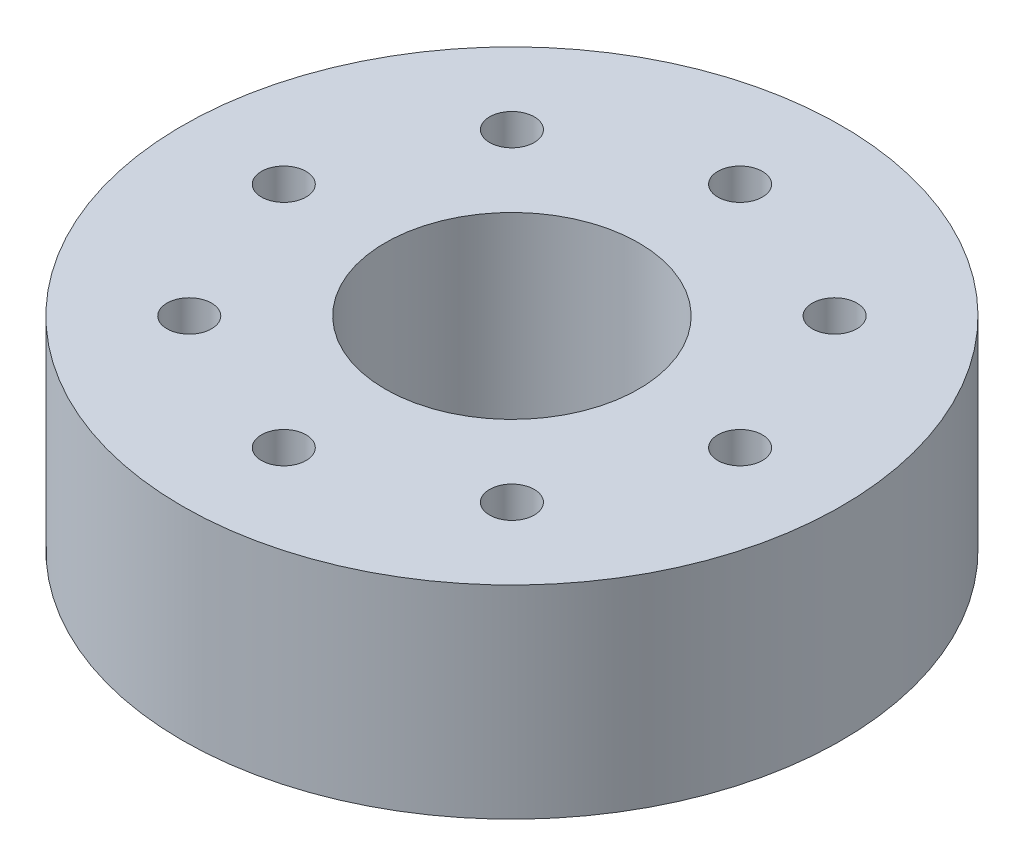
ISO-10303-21;
HEADER;
FILE_DESCRIPTION(('STEP AP214'),'2;1');
FILE_NAME('part.step','',(''),(''),'','','');
FILE_SCHEMA(('AUTOMOTIVE_DESIGN { 1 0 10303 214 1 1 1 1 }'));
ENDSEC;
DATA;
#1=APPLICATION_CONTEXT('core data for automotive mechanical design processes');
#2=APPLICATION_PROTOCOL_DEFINITION('international standard','automotive_design',2000,#1);
#3=PRODUCT_CONTEXT('',#1,'mechanical');
#4=PRODUCT('Part','Part','',(#3));
#5=PRODUCT_RELATED_PRODUCT_CATEGORY('part','',(#4));
#6=PRODUCT_DEFINITION_FORMATION('','',#4);
#7=PRODUCT_DEFINITION_CONTEXT('part definition',#1,'design');
#8=PRODUCT_DEFINITION('design','',#6,#7);
#9=PRODUCT_DEFINITION_SHAPE('','',#8);
#10=(LENGTH_UNIT() NAMED_UNIT(*) SI_UNIT(.MILLI.,.METRE.));
#11=(NAMED_UNIT(*) PLANE_ANGLE_UNIT() SI_UNIT($,.RADIAN.));
#12=(NAMED_UNIT(*) SI_UNIT($,.STERADIAN.) SOLID_ANGLE_UNIT());
#13=UNCERTAINTY_MEASURE_WITH_UNIT(LENGTH_MEASURE(1.E-05),#10,'distance_accuracy_value','');
#14=(GEOMETRIC_REPRESENTATION_CONTEXT(3) GLOBAL_UNCERTAINTY_ASSIGNED_CONTEXT((#13)) GLOBAL_UNIT_ASSIGNED_CONTEXT((#10,
#11,#12)) REPRESENTATION_CONTEXT('',''));
#15=CARTESIAN_POINT('',(0.,0.,0.));
#16=DIRECTION('',(0.,0.,1.));
#17=DIRECTION('',(1.,0.,0.));
#18=AXIS2_PLACEMENT_3D('',#15,#16,#17);
#19=CARTESIAN_POINT('',(0.,20.,0.));
#20=DIRECTION('',(0.,-1.,0.));
#21=DIRECTION('',(0.,0.,-1.));
#22=AXIS2_PLACEMENT_3D('',#19,#20,#21);
#23=CYLINDRICAL_SURFACE('',#22,32.5);
#24=CARTESIAN_POINT('',(0.,20.,0.));
#25=DIRECTION('',(0.,1.,0.));
#26=DIRECTION('',(0.,0.,1.));
#27=AXIS2_PLACEMENT_3D('',#24,#25,#26);
#28=CIRCLE('',#27,32.5);
#29=CARTESIAN_POINT('',(0.,20.,32.5));
#30=VERTEX_POINT('',#29);
#31=EDGE_CURVE('E10',#30,#30,#28,.T.);
#32=ORIENTED_EDGE('',*,*,#31,.F.);
#33=EDGE_LOOP('',(#32));
#34=FACE_BOUND('',#33,.T.);
#35=CARTESIAN_POINT('',(0.,0.,0.));
#36=DIRECTION('',(0.,1.,0.));
#37=DIRECTION('',(0.,0.,1.));
#38=AXIS2_PLACEMENT_3D('',#35,#36,#37);
#39=CIRCLE('',#38,32.5);
#40=CARTESIAN_POINT('',(0.,0.,32.5));
#41=VERTEX_POINT('',#40);
#42=EDGE_CURVE('E40',#41,#41,#39,.T.);
#43=ORIENTED_EDGE('',*,*,#42,.T.);
#44=EDGE_LOOP('',(#43));
#45=FACE_BOUND('',#44,.T.);
#46=ADVANCED_FACE('F37',(#34,#45),#23,.T.);
#47=CARTESIAN_POINT('',(0.,20.,0.));
#48=DIRECTION('',(0.,1.,0.));
#49=DIRECTION('',(0.,0.,1.));
#50=AXIS2_PLACEMENT_3D('',#47,#48,#49);
#51=PLANE('',#50);
#52=CARTESIAN_POINT('',(0.,20.,0.));
#53=DIRECTION('',(0.,1.,0.));
#54=DIRECTION('',(0.,0.,1.));
#55=AXIS2_PLACEMENT_3D('',#52,#53,#54);
#56=CIRCLE('',#55,12.5);
#57=CARTESIAN_POINT('',(0.,20.,12.5));
#58=VERTEX_POINT('',#57);
#59=EDGE_CURVE('E115',#58,#58,#56,.T.);
#60=ORIENTED_EDGE('',*,*,#59,.F.);
#61=EDGE_LOOP('',(#60));
#62=FACE_BOUND('',#61,.T.);
#63=CARTESIAN_POINT('',(0.,20.,-22.5));
#64=DIRECTION('',(0.,1.,0.));
#65=DIRECTION('',(0.,0.,1.));
#66=AXIS2_PLACEMENT_3D('',#63,#64,#65);
#67=CIRCLE('',#66,2.2);
#68=CARTESIAN_POINT('',(0.,20.,-20.3));
#69=VERTEX_POINT('',#68);
#70=EDGE_CURVE('E108',#69,#69,#67,.T.);
#71=ORIENTED_EDGE('',*,*,#70,.F.);
#72=EDGE_LOOP('',(#71));
#73=FACE_BOUND('',#72,.T.);
#74=CARTESIAN_POINT('',(15.9099025766973,20.,-15.9099025766973));
#75=DIRECTION('',(0.,1.,0.));
#76=DIRECTION('',(0.,0.,1.));
#77=AXIS2_PLACEMENT_3D('',#74,#75,#76);
#78=CIRCLE('',#77,2.2);
#79=CARTESIAN_POINT('',(15.9099025766973,20.,-13.7099025766973));
#80=VERTEX_POINT('',#79);
#81=EDGE_CURVE('E100',#80,#80,#78,.T.);
#82=ORIENTED_EDGE('',*,*,#81,.F.);
#83=EDGE_LOOP('',(#82));
#84=FACE_BOUND('',#83,.T.);
#85=CARTESIAN_POINT('',(22.5,20.,0.));
#86=DIRECTION('',(0.,1.,0.));
#87=DIRECTION('',(0.,0.,1.));
#88=AXIS2_PLACEMENT_3D('',#85,#86,#87);
#89=CIRCLE('',#88,2.2);
#90=CARTESIAN_POINT('',(22.5,20.,2.20000000000008));
#91=VERTEX_POINT('',#90);
#92=EDGE_CURVE('E92',#91,#91,#89,.T.);
#93=ORIENTED_EDGE('',*,*,#92,.F.);
#94=EDGE_LOOP('',(#93));
#95=FACE_BOUND('',#94,.T.);
#96=CARTESIAN_POINT('',(15.9099025766972,20.,15.9099025766974));
#97=DIRECTION('',(0.,1.,0.));
#98=DIRECTION('',(0.,0.,1.));
#99=AXIS2_PLACEMENT_3D('',#96,#97,#98);
#100=CIRCLE('',#99,2.2);
#101=CARTESIAN_POINT('',(15.9099025766972,20.,18.1099025766974));
#102=VERTEX_POINT('',#101);
#103=EDGE_CURVE('E84',#102,#102,#100,.T.);
#104=ORIENTED_EDGE('',*,*,#103,.F.);
#105=EDGE_LOOP('',(#104));
#106=FACE_BOUND('',#105,.T.);
#107=CARTESIAN_POINT('',(-1.57116660247941E-13,20.,22.5));
#108=DIRECTION('',(0.,1.,0.));
#109=DIRECTION('',(0.,0.,1.));
#110=AXIS2_PLACEMENT_3D('',#107,#108,#109);
#111=CIRCLE('',#110,2.2);
#112=CARTESIAN_POINT('',(-1.57116660247941E-13,20.,24.7));
#113=VERTEX_POINT('',#112);
#114=EDGE_CURVE('E76',#113,#113,#111,.T.);
#115=ORIENTED_EDGE('',*,*,#114,.F.);
#116=EDGE_LOOP('',(#115));
#117=FACE_BOUND('',#116,.T.);
#118=CARTESIAN_POINT('',(-15.9099025766975,20.,15.9099025766972));
#119=DIRECTION('',(0.,1.,0.));
#120=DIRECTION('',(0.,0.,1.));
#121=AXIS2_PLACEMENT_3D('',#118,#119,#120);
#122=CIRCLE('',#121,2.2);
#123=CARTESIAN_POINT('',(-15.9099025766975,20.,18.1099025766972));
#124=VERTEX_POINT('',#123);
#125=EDGE_CURVE('E68',#124,#124,#122,.T.);
#126=ORIENTED_EDGE('',*,*,#125,.F.);
#127=EDGE_LOOP('',(#126));
#128=FACE_BOUND('',#127,.T.);
#129=CARTESIAN_POINT('',(-22.5,20.,-2.35674990371912E-13));
#130=DIRECTION('',(0.,1.,0.));
#131=DIRECTION('',(0.,0.,1.));
#132=AXIS2_PLACEMENT_3D('',#129,#130,#131);
#133=CIRCLE('',#132,2.2);
#134=CARTESIAN_POINT('',(-22.5,20.,2.19999999999977));
#135=VERTEX_POINT('',#134);
#136=EDGE_CURVE('E60',#135,#135,#133,.T.);
#137=ORIENTED_EDGE('',*,*,#136,.F.);
#138=EDGE_LOOP('',(#137));
#139=FACE_BOUND('',#138,.T.);
#140=CARTESIAN_POINT('',(-15.9099025766971,20.,-15.9099025766975));
#141=DIRECTION('',(0.,1.,0.));
#142=DIRECTION('',(0.,0.,1.));
#143=AXIS2_PLACEMENT_3D('',#140,#141,#142);
#144=CIRCLE('',#143,2.2);
#145=CARTESIAN_POINT('',(-15.9099025766971,20.,-13.7099025766975));
#146=VERTEX_POINT('',#145);
#147=EDGE_CURVE('E51',#146,#146,#144,.T.);
#148=ORIENTED_EDGE('',*,*,#147,.F.);
#149=EDGE_LOOP('',(#148));
#150=FACE_BOUND('',#149,.T.);
#151=ORIENTED_EDGE('',*,*,#31,.T.);
#152=EDGE_LOOP('',(#151));
#153=FACE_BOUND('',#152,.T.);
#154=ADVANCED_FACE('F133',(#62,#73,#84,#95,#106,#117,#128,#139,#150,#153),#51,.T.);
#155=CARTESIAN_POINT('',(0.,0.,0.));
#156=DIRECTION('',(0.,1.,0.));
#157=DIRECTION('',(0.,0.,1.));
#158=AXIS2_PLACEMENT_3D('',#155,#156,#157);
#159=PLANE('',#158);
#160=CARTESIAN_POINT('',(0.,0.,0.));
#161=DIRECTION('',(0.,1.,0.));
#162=DIRECTION('',(0.,0.,1.));
#163=AXIS2_PLACEMENT_3D('',#160,#161,#162);
#164=CIRCLE('',#163,12.5);
#165=CARTESIAN_POINT('',(0.,0.,12.5));
#166=VERTEX_POINT('',#165);
#167=EDGE_CURVE('E56',#166,#166,#164,.T.);
#168=ORIENTED_EDGE('',*,*,#167,.T.);
#169=EDGE_LOOP('',(#168));
#170=FACE_BOUND('',#169,.T.);
#171=CARTESIAN_POINT('',(0.,0.,-22.5));
#172=DIRECTION('',(0.,1.,0.));
#173=DIRECTION('',(0.,0.,1.));
#174=AXIS2_PLACEMENT_3D('',#171,#172,#173);
#175=CIRCLE('',#174,2.2);
#176=CARTESIAN_POINT('',(0.,0.,-20.3));
#177=VERTEX_POINT('',#176);
#178=EDGE_CURVE('E49',#177,#177,#175,.T.);
#179=ORIENTED_EDGE('',*,*,#178,.T.);
#180=EDGE_LOOP('',(#179));
#181=FACE_BOUND('',#180,.T.);
#182=CARTESIAN_POINT('',(15.9099025766973,0.,-15.9099025766973));
#183=DIRECTION('',(0.,1.,0.));
#184=DIRECTION('',(0.,0.,1.));
#185=AXIS2_PLACEMENT_3D('',#182,#183,#184);
#186=CIRCLE('',#185,2.2);
#187=CARTESIAN_POINT('',(15.9099025766973,0.,-13.7099025766973));
#188=VERTEX_POINT('',#187);
#189=EDGE_CURVE('E104',#188,#188,#186,.T.);
#190=ORIENTED_EDGE('',*,*,#189,.T.);
#191=EDGE_LOOP('',(#190));
#192=FACE_BOUND('',#191,.T.);
#193=CARTESIAN_POINT('',(22.5,0.,0.));
#194=DIRECTION('',(0.,1.,0.));
#195=DIRECTION('',(0.,0.,1.));
#196=AXIS2_PLACEMENT_3D('',#193,#194,#195);
#197=CIRCLE('',#196,2.2);
#198=CARTESIAN_POINT('',(22.5,0.,2.20000000000008));
#199=VERTEX_POINT('',#198);
#200=EDGE_CURVE('E96',#199,#199,#197,.T.);
#201=ORIENTED_EDGE('',*,*,#200,.T.);
#202=EDGE_LOOP('',(#201));
#203=FACE_BOUND('',#202,.T.);
#204=CARTESIAN_POINT('',(15.9099025766972,0.,15.9099025766974));
#205=DIRECTION('',(0.,1.,0.));
#206=DIRECTION('',(0.,0.,1.));
#207=AXIS2_PLACEMENT_3D('',#204,#205,#206);
#208=CIRCLE('',#207,2.2);
#209=CARTESIAN_POINT('',(15.9099025766972,0.,18.1099025766974));
#210=VERTEX_POINT('',#209);
#211=EDGE_CURVE('E88',#210,#210,#208,.T.);
#212=ORIENTED_EDGE('',*,*,#211,.T.);
#213=EDGE_LOOP('',(#212));
#214=FACE_BOUND('',#213,.T.);
#215=CARTESIAN_POINT('',(-1.57116660247941E-13,0.,22.5));
#216=DIRECTION('',(0.,1.,0.));
#217=DIRECTION('',(0.,0.,1.));
#218=AXIS2_PLACEMENT_3D('',#215,#216,#217);
#219=CIRCLE('',#218,2.2);
#220=CARTESIAN_POINT('',(-1.57116660247941E-13,0.,24.7));
#221=VERTEX_POINT('',#220);
#222=EDGE_CURVE('E80',#221,#221,#219,.T.);
#223=ORIENTED_EDGE('',*,*,#222,.T.);
#224=EDGE_LOOP('',(#223));
#225=FACE_BOUND('',#224,.T.);
#226=CARTESIAN_POINT('',(-15.9099025766975,0.,15.9099025766972));
#227=DIRECTION('',(0.,1.,0.));
#228=DIRECTION('',(0.,0.,1.));
#229=AXIS2_PLACEMENT_3D('',#226,#227,#228);
#230=CIRCLE('',#229,2.2);
#231=CARTESIAN_POINT('',(-15.9099025766975,0.,18.1099025766972));
#232=VERTEX_POINT('',#231);
#233=EDGE_CURVE('E72',#232,#232,#230,.T.);
#234=ORIENTED_EDGE('',*,*,#233,.T.);
#235=EDGE_LOOP('',(#234));
#236=FACE_BOUND('',#235,.T.);
#237=CARTESIAN_POINT('',(-22.5,0.,-2.35674990371912E-13));
#238=DIRECTION('',(0.,1.,0.));
#239=DIRECTION('',(0.,0.,1.));
#240=AXIS2_PLACEMENT_3D('',#237,#238,#239);
#241=CIRCLE('',#240,2.2);
#242=CARTESIAN_POINT('',(-22.5,0.,2.19999999999977));
#243=VERTEX_POINT('',#242);
#244=EDGE_CURVE('E64',#243,#243,#241,.T.);
#245=ORIENTED_EDGE('',*,*,#244,.T.);
#246=EDGE_LOOP('',(#245));
#247=FACE_BOUND('',#246,.T.);
#248=CARTESIAN_POINT('',(-15.9099025766971,0.,-15.9099025766975));
#249=DIRECTION('',(0.,1.,0.));
#250=DIRECTION('',(0.,0.,1.));
#251=AXIS2_PLACEMENT_3D('',#248,#249,#250);
#252=CIRCLE('',#251,2.2);
#253=CARTESIAN_POINT('',(-15.9099025766971,0.,-13.7099025766975));
#254=VERTEX_POINT('',#253);
#255=EDGE_CURVE('E55',#254,#254,#252,.T.);
#256=ORIENTED_EDGE('',*,*,#255,.T.);
#257=EDGE_LOOP('',(#256));
#258=FACE_BOUND('',#257,.T.);
#259=ORIENTED_EDGE('',*,*,#42,.F.);
#260=EDGE_LOOP('',(#259));
#261=FACE_BOUND('',#260,.T.);
#262=ADVANCED_FACE('F123',(#170,#181,#192,#203,#214,#225,#236,#247,#258,#261),#159,.F.);
#263=CARTESIAN_POINT('',(-15.9099025766971,0.,-15.9099025766975));
#264=DIRECTION('',(0.,1.,0.));
#265=DIRECTION('',(0.,0.,1.));
#266=AXIS2_PLACEMENT_3D('',#263,#264,#265);
#267=CYLINDRICAL_SURFACE('',#266,2.2);
#268=ORIENTED_EDGE('',*,*,#255,.F.);
#269=EDGE_LOOP('',(#268));
#270=FACE_BOUND('',#269,.T.);
#271=ORIENTED_EDGE('',*,*,#147,.T.);
#272=EDGE_LOOP('',(#271));
#273=FACE_BOUND('',#272,.T.);
#274=ADVANCED_FACE('F153',(#270,#273),#267,.F.);
#275=CARTESIAN_POINT('',(-22.5,0.,-2.35674990371912E-13));
#276=DIRECTION('',(0.,1.,0.));
#277=DIRECTION('',(0.,0.,1.));
#278=AXIS2_PLACEMENT_3D('',#275,#276,#277);
#279=CYLINDRICAL_SURFACE('',#278,2.2);
#280=ORIENTED_EDGE('',*,*,#244,.F.);
#281=EDGE_LOOP('',(#280));
#282=FACE_BOUND('',#281,.T.);
#283=ORIENTED_EDGE('',*,*,#136,.T.);
#284=EDGE_LOOP('',(#283));
#285=FACE_BOUND('',#284,.T.);
#286=ADVANCED_FACE('F155',(#282,#285),#279,.F.);
#287=CARTESIAN_POINT('',(-15.9099025766975,0.,15.9099025766972));
#288=DIRECTION('',(0.,1.,0.));
#289=DIRECTION('',(0.,0.,1.));
#290=AXIS2_PLACEMENT_3D('',#287,#288,#289);
#291=CYLINDRICAL_SURFACE('',#290,2.2);
#292=ORIENTED_EDGE('',*,*,#233,.F.);
#293=EDGE_LOOP('',(#292));
#294=FACE_BOUND('',#293,.T.);
#295=ORIENTED_EDGE('',*,*,#125,.T.);
#296=EDGE_LOOP('',(#295));
#297=FACE_BOUND('',#296,.T.);
#298=ADVANCED_FACE('F162',(#294,#297),#291,.F.);
#299=CARTESIAN_POINT('',(-1.57116660247941E-13,0.,22.5));
#300=DIRECTION('',(0.,1.,0.));
#301=DIRECTION('',(0.,0.,1.));
#302=AXIS2_PLACEMENT_3D('',#299,#300,#301);
#303=CYLINDRICAL_SURFACE('',#302,2.2);
#304=ORIENTED_EDGE('',*,*,#222,.F.);
#305=EDGE_LOOP('',(#304));
#306=FACE_BOUND('',#305,.T.);
#307=ORIENTED_EDGE('',*,*,#114,.T.);
#308=EDGE_LOOP('',(#307));
#309=FACE_BOUND('',#308,.T.);
#310=ADVANCED_FACE('F220',(#306,#309),#303,.F.);
#311=CARTESIAN_POINT('',(15.9099025766972,0.,15.9099025766974));
#312=DIRECTION('',(0.,1.,0.));
#313=DIRECTION('',(0.,0.,1.));
#314=AXIS2_PLACEMENT_3D('',#311,#312,#313);
#315=CYLINDRICAL_SURFACE('',#314,2.2);
#316=ORIENTED_EDGE('',*,*,#211,.F.);
#317=EDGE_LOOP('',(#316));
#318=FACE_BOUND('',#317,.T.);
#319=ORIENTED_EDGE('',*,*,#103,.T.);
#320=EDGE_LOOP('',(#319));
#321=FACE_BOUND('',#320,.T.);
#322=ADVANCED_FACE('F212',(#318,#321),#315,.F.);
#323=CARTESIAN_POINT('',(22.5,0.,0.));
#324=DIRECTION('',(0.,1.,0.));
#325=DIRECTION('',(0.,0.,1.));
#326=AXIS2_PLACEMENT_3D('',#323,#324,#325);
#327=CYLINDRICAL_SURFACE('',#326,2.2);
#328=ORIENTED_EDGE('',*,*,#200,.F.);
#329=EDGE_LOOP('',(#328));
#330=FACE_BOUND('',#329,.T.);
#331=ORIENTED_EDGE('',*,*,#92,.T.);
#332=EDGE_LOOP('',(#331));
#333=FACE_BOUND('',#332,.T.);
#334=ADVANCED_FACE('F204',(#330,#333),#327,.F.);
#335=CARTESIAN_POINT('',(15.9099025766973,0.,-15.9099025766973));
#336=DIRECTION('',(0.,1.,0.));
#337=DIRECTION('',(0.,0.,1.));
#338=AXIS2_PLACEMENT_3D('',#335,#336,#337);
#339=CYLINDRICAL_SURFACE('',#338,2.2);
#340=ORIENTED_EDGE('',*,*,#189,.F.);
#341=EDGE_LOOP('',(#340));
#342=FACE_BOUND('',#341,.T.);
#343=ORIENTED_EDGE('',*,*,#81,.T.);
#344=EDGE_LOOP('',(#343));
#345=FACE_BOUND('',#344,.T.);
#346=ADVANCED_FACE('F197',(#342,#345),#339,.F.);
#347=CARTESIAN_POINT('',(0.,0.,-22.5));
#348=DIRECTION('',(0.,1.,0.));
#349=DIRECTION('',(0.,0.,1.));
#350=AXIS2_PLACEMENT_3D('',#347,#348,#349);
#351=CYLINDRICAL_SURFACE('',#350,2.2);
#352=ORIENTED_EDGE('',*,*,#178,.F.);
#353=EDGE_LOOP('',(#352));
#354=FACE_BOUND('',#353,.T.);
#355=ORIENTED_EDGE('',*,*,#70,.T.);
#356=EDGE_LOOP('',(#355));
#357=FACE_BOUND('',#356,.T.);
#358=ADVANCED_FACE('F129',(#354,#357),#351,.F.);
#359=CARTESIAN_POINT('',(0.,0.,0.));
#360=DIRECTION('',(0.,1.,0.));
#361=DIRECTION('',(0.,0.,1.));
#362=AXIS2_PLACEMENT_3D('',#359,#360,#361);
#363=CYLINDRICAL_SURFACE('',#362,12.5);
#364=ORIENTED_EDGE('',*,*,#167,.F.);
#365=EDGE_LOOP('',(#364));
#366=FACE_BOUND('',#365,.T.);
#367=ORIENTED_EDGE('',*,*,#59,.T.);
#368=EDGE_LOOP('',(#367));
#369=FACE_BOUND('',#368,.T.);
#370=ADVANCED_FACE('F126',(#366,#369),#363,.F.);
#371=CLOSED_SHELL('',(#46,#154,#262,#274,#286,#298,#310,#322,#334,#346,#358,#370));
#372=MANIFOLD_SOLID_BREP('B2',#371);
#373=ADVANCED_BREP_SHAPE_REPRESENTATION('',(#18,#372),#14);
#374=SHAPE_DEFINITION_REPRESENTATION(#9,#373);
ENDSEC;
END-ISO-10303-21;
